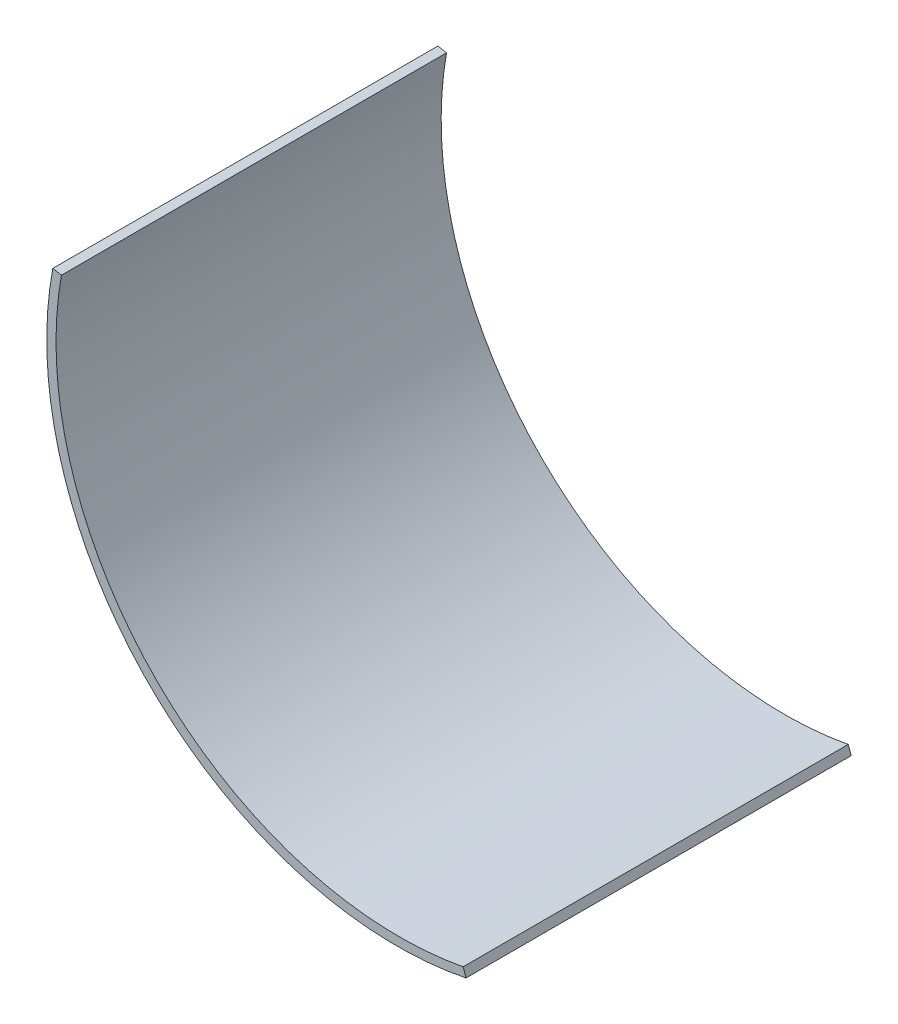
ISO-10303-21;
HEADER;
FILE_DESCRIPTION(('STEP AP214'),'2;1');
FILE_NAME('part.step','',(''),(''),'','','');
FILE_SCHEMA(('AUTOMOTIVE_DESIGN { 1 0 10303 214 1 1 1 1 }'));
ENDSEC;
DATA;
#1=APPLICATION_CONTEXT('core data for automotive mechanical design processes');
#2=APPLICATION_PROTOCOL_DEFINITION('international standard','automotive_design',2000,#1);
#3=PRODUCT_CONTEXT('',#1,'mechanical');
#4=PRODUCT('Part','Part','',(#3));
#5=PRODUCT_RELATED_PRODUCT_CATEGORY('part','',(#4));
#6=PRODUCT_DEFINITION_FORMATION('','',#4);
#7=PRODUCT_DEFINITION_CONTEXT('part definition',#1,'design');
#8=PRODUCT_DEFINITION('design','',#6,#7);
#9=PRODUCT_DEFINITION_SHAPE('','',#8);
#10=(LENGTH_UNIT() NAMED_UNIT(*) SI_UNIT(.MILLI.,.METRE.));
#11=(NAMED_UNIT(*) PLANE_ANGLE_UNIT() SI_UNIT($,.RADIAN.));
#12=(NAMED_UNIT(*) SI_UNIT($,.STERADIAN.) SOLID_ANGLE_UNIT());
#13=UNCERTAINTY_MEASURE_WITH_UNIT(LENGTH_MEASURE(1.E-05),#10,'distance_accuracy_value','');
#14=(GEOMETRIC_REPRESENTATION_CONTEXT(3) GLOBAL_UNCERTAINTY_ASSIGNED_CONTEXT((#13)) GLOBAL_UNIT_ASSIGNED_CONTEXT((#10,
#11,#12)) REPRESENTATION_CONTEXT('',''));
#15=CARTESIAN_POINT('',(0.,0.,0.));
#16=DIRECTION('',(0.,0.,1.));
#17=DIRECTION('',(1.,0.,0.));
#18=AXIS2_PLACEMENT_3D('',#15,#16,#17);
#19=CARTESIAN_POINT('',(-25.0799396468354,124.498982434842,139.7));
#20=DIRECTION('',(0.,0.,-1.));
#21=DIRECTION('',(-1.,0.,0.));
#22=AXIS2_PLACEMENT_3D('',#19,#20,#21);
#23=CYLINDRICAL_SURFACE('',#22,127.);
#24=CARTESIAN_POINT('',(-25.0799396468354,124.498982434842,0.));
#25=DIRECTION('',(0.,0.,1.));
#26=DIRECTION('',(-1.,0.,0.));
#27=AXIS2_PLACEMENT_3D('',#24,#25,#26);
#28=CIRCLE('',#27,127.);
#29=CARTESIAN_POINT('',(-149.891869348398,147.971992556516,0.));
#30=VERTEX_POINT('',#29);
#31=CARTESIAN_POINT('',(0.,0.,0.));
#32=VERTEX_POINT('',#31);
#33=EDGE_CURVE('E96',#30,#32,#28,.T.);
#34=ORIENTED_EDGE('',*,*,#33,.T.);
#35=DIRECTION('',(0.,0.,-1.));
#36=VECTOR('',#35,1.);
#37=CARTESIAN_POINT('',(0.,0.,139.7));
#38=LINE('',#37,#36);
#39=CARTESIAN_POINT('',(0.,0.,139.7));
#40=VERTEX_POINT('',#39);
#41=EDGE_CURVE('E11',#40,#32,#38,.T.);
#42=ORIENTED_EDGE('',*,*,#41,.F.);
#43=CARTESIAN_POINT('',(-25.0799396468354,124.498982434842,139.7));
#44=DIRECTION('',(0.,0.,1.));
#45=DIRECTION('',(-1.,0.,0.));
#46=AXIS2_PLACEMENT_3D('',#43,#44,#45);
#47=CIRCLE('',#46,127.);
#48=CARTESIAN_POINT('',(-149.891869348398,147.971992556516,139.7));
#49=VERTEX_POINT('',#48);
#50=EDGE_CURVE('E84',#49,#40,#47,.T.);
#51=ORIENTED_EDGE('',*,*,#50,.F.);
#52=DIRECTION('',(0.,0.,-1.));
#53=VECTOR('',#52,1.);
#54=CARTESIAN_POINT('',(-149.891869348398,147.971992556516,139.7));
#55=LINE('',#54,#53);
#56=EDGE_CURVE('E92',#49,#30,#55,.T.);
#57=ORIENTED_EDGE('',*,*,#56,.T.);
#58=EDGE_LOOP('',(#34,#42,#51,#57));
#59=FACE_BOUND('',#58,.T.);
#60=ADVANCED_FACE('F33',(#59),#23,.T.);
#61=CARTESIAN_POINT('',(0.,0.,139.7));
#62=DIRECTION('',(-0.943051657189027,-0.332646316487992,0.));
#63=DIRECTION('',(0.332646316487992,-0.943051657189027,0.));
#64=AXIS2_PLACEMENT_3D('',#61,#62,#63);
#65=PLANE('',#64);
#66=DIRECTION('',(-0.332646316487992,0.943051657189027,0.));
#67=VECTOR('',#66,1.);
#68=CARTESIAN_POINT('',(0.,0.,0.));
#69=LINE('',#68,#67);
#70=CARTESIAN_POINT('',(-1.05615205484937,2.99418901157516,0.));
#71=VERTEX_POINT('',#70);
#72=EDGE_CURVE('E88',#32,#71,#69,.T.);
#73=ORIENTED_EDGE('',*,*,#72,.T.);
#74=DIRECTION('',(0.,0.,-1.));
#75=VECTOR('',#74,1.);
#76=CARTESIAN_POINT('',(-1.05615205484937,2.99418901157516,139.7));
#77=LINE('',#76,#75);
#78=CARTESIAN_POINT('',(-1.05615205484937,2.99418901157516,139.7));
#79=VERTEX_POINT('',#78);
#80=EDGE_CURVE('E41',#79,#71,#77,.T.);
#81=ORIENTED_EDGE('',*,*,#80,.F.);
#82=DIRECTION('',(-0.332646316487992,0.943051657189027,0.));
#83=VECTOR('',#82,1.);
#84=CARTESIAN_POINT('',(0.,0.,139.7));
#85=LINE('',#84,#83);
#86=EDGE_CURVE('E79',#40,#79,#85,.T.);
#87=ORIENTED_EDGE('',*,*,#86,.F.);
#88=ORIENTED_EDGE('',*,*,#41,.T.);
#89=EDGE_LOOP('',(#73,#81,#87,#88));
#90=FACE_BOUND('',#89,.T.);
#91=ADVANCED_FACE('F87',(#90),#65,.F.);
#92=CARTESIAN_POINT('',(-24.1423338891406,125.41774018833,139.7));
#93=DIRECTION('',(0.,0.,-1.));
#94=DIRECTION('',(-1.,0.,0.));
#95=AXIS2_PLACEMENT_3D('',#92,#93,#94);
#96=CYLINDRICAL_SURFACE('',#95,124.581289423466);
#97=CARTESIAN_POINT('',(-24.1423338891406,125.41774018833,0.));
#98=DIRECTION('',(0.,0.,-1.));
#99=DIRECTION('',(1.,0.,0.));
#100=AXIS2_PLACEMENT_3D('',#97,#98,#99);
#101=CIRCLE('',#100,124.581289423466);
#102=CARTESIAN_POINT('',(-146.771571105859,147.385167303474,0.));
#103=VERTEX_POINT('',#102);
#104=EDGE_CURVE('E66',#71,#103,#101,.T.);
#105=ORIENTED_EDGE('',*,*,#104,.T.);
#106=DIRECTION('',(0.,0.,-1.));
#107=VECTOR('',#106,1.);
#108=CARTESIAN_POINT('',(-146.771571105859,147.385167303474,139.7));
#109=LINE('',#108,#107);
#110=CARTESIAN_POINT('',(-146.771571105859,147.385167303474,139.7));
#111=VERTEX_POINT('',#110);
#112=EDGE_CURVE('E89',#111,#103,#109,.T.);
#113=ORIENTED_EDGE('',*,*,#112,.F.);
#114=CARTESIAN_POINT('',(-24.1423338891406,125.41774018833,139.7));
#115=DIRECTION('',(0.,0.,-1.));
#116=DIRECTION('',(1.,0.,0.));
#117=AXIS2_PLACEMENT_3D('',#114,#115,#116);
#118=CIRCLE('',#117,124.581289423466);
#119=EDGE_CURVE('E82',#79,#111,#118,.T.);
#120=ORIENTED_EDGE('',*,*,#119,.F.);
#121=ORIENTED_EDGE('',*,*,#80,.T.);
#122=EDGE_LOOP('',(#105,#113,#120,#121));
#123=FACE_BOUND('',#122,.T.);
#124=ADVANCED_FACE('F90',(#123),#96,.F.);
#125=CARTESIAN_POINT('',(-149.891869348398,147.971992556516,139.7));
#126=DIRECTION('',(-0.184826851351755,-0.982771100012305,0.));
#127=DIRECTION('',(0.982771100012305,-0.184826851351755,0.));
#128=AXIS2_PLACEMENT_3D('',#125,#126,#127);
#129=PLANE('',#128);
#130=DIRECTION('',(-0.982771100012305,0.184826851351755,0.));
#131=VECTOR('',#130,1.);
#132=CARTESIAN_POINT('',(-149.891869348398,147.971992556516,0.));
#133=LINE('',#132,#131);
#134=EDGE_CURVE('E72',#103,#30,#133,.T.);
#135=ORIENTED_EDGE('',*,*,#134,.T.);
#136=ORIENTED_EDGE('',*,*,#56,.F.);
#137=DIRECTION('',(-0.982771100012305,0.184826851351755,0.));
#138=VECTOR('',#137,1.);
#139=CARTESIAN_POINT('',(-149.891869348398,147.971992556516,139.7));
#140=LINE('',#139,#138);
#141=EDGE_CURVE('E49',#111,#49,#140,.T.);
#142=ORIENTED_EDGE('',*,*,#141,.F.);
#143=ORIENTED_EDGE('',*,*,#112,.T.);
#144=EDGE_LOOP('',(#135,#136,#142,#143));
#145=FACE_BOUND('',#144,.T.);
#146=ADVANCED_FACE('F103',(#145),#129,.F.);
#147=CARTESIAN_POINT('',(-25.0799396468354,124.498982434842,139.7));
#148=DIRECTION('',(0.,0.,-1.));
#149=DIRECTION('',(-1.,0.,0.));
#150=AXIS2_PLACEMENT_3D('',#147,#148,#149);
#151=PLANE('',#150);
#152=ORIENTED_EDGE('',*,*,#50,.T.);
#153=ORIENTED_EDGE('',*,*,#86,.T.);
#154=ORIENTED_EDGE('',*,*,#119,.T.);
#155=ORIENTED_EDGE('',*,*,#141,.T.);
#156=EDGE_LOOP('',(#152,#153,#154,#155));
#157=FACE_BOUND('',#156,.T.);
#158=ADVANCED_FACE('F80',(#157),#151,.F.);
#159=CARTESIAN_POINT('',(-25.0799396468354,124.498982434842,0.));
#160=DIRECTION('',(0.,0.,-1.));
#161=DIRECTION('',(-1.,0.,0.));
#162=AXIS2_PLACEMENT_3D('',#159,#160,#161);
#163=PLANE('',#162);
#164=ORIENTED_EDGE('',*,*,#33,.F.);
#165=ORIENTED_EDGE('',*,*,#134,.F.);
#166=ORIENTED_EDGE('',*,*,#104,.F.);
#167=ORIENTED_EDGE('',*,*,#72,.F.);
#168=EDGE_LOOP('',(#164,#165,#166,#167));
#169=FACE_BOUND('',#168,.T.);
#170=ADVANCED_FACE('F106',(#169),#163,.T.);
#171=CLOSED_SHELL('',(#60,#91,#124,#146,#158,#170));
#172=MANIFOLD_SOLID_BREP('B2',#171);
#173=ADVANCED_BREP_SHAPE_REPRESENTATION('',(#18,#172),#14);
#174=SHAPE_DEFINITION_REPRESENTATION(#9,#173);
ENDSEC;
END-ISO-10303-21;
